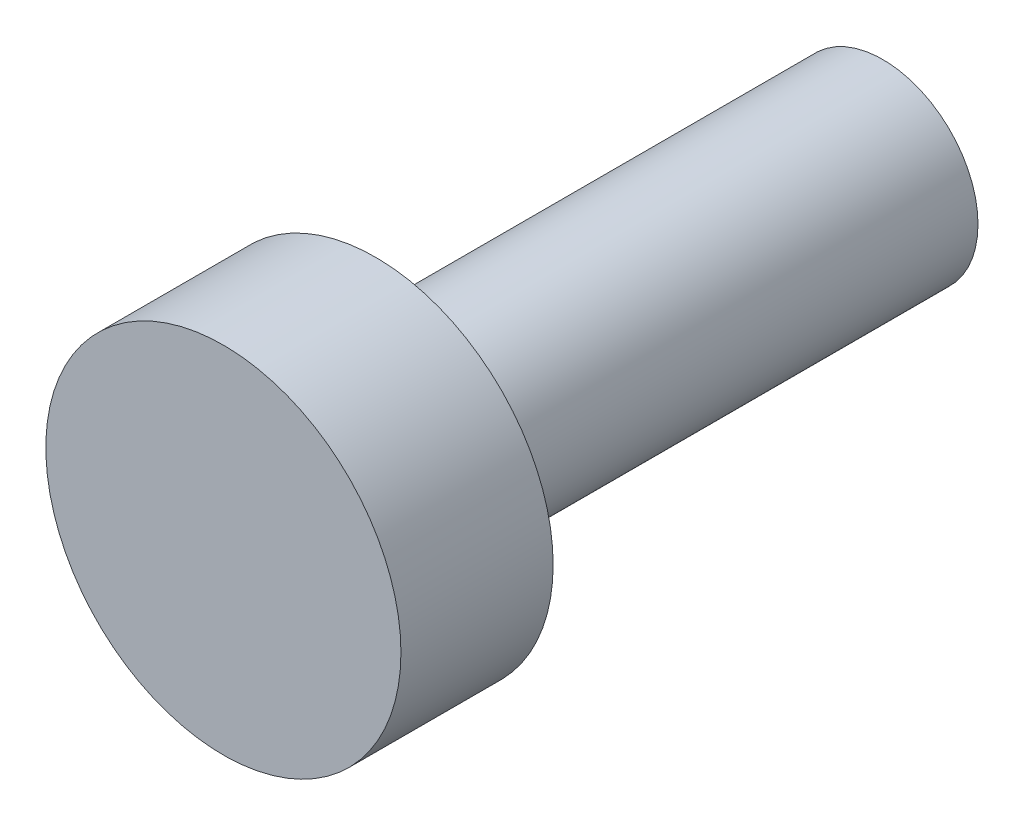
ISO-10303-21;
HEADER;
FILE_DESCRIPTION(('STEP AP214'),'2;1');
FILE_NAME('part.step','',(''),(''),'','','');
FILE_SCHEMA(('AUTOMOTIVE_DESIGN { 1 0 10303 214 1 1 1 1 }'));
ENDSEC;
DATA;
#1=APPLICATION_CONTEXT('core data for automotive mechanical design processes');
#2=APPLICATION_PROTOCOL_DEFINITION('international standard','automotive_design',2000,#1);
#3=PRODUCT_CONTEXT('',#1,'mechanical');
#4=PRODUCT('Part','Part','',(#3));
#5=PRODUCT_RELATED_PRODUCT_CATEGORY('part','',(#4));
#6=PRODUCT_DEFINITION_FORMATION('','',#4);
#7=PRODUCT_DEFINITION_CONTEXT('part definition',#1,'design');
#8=PRODUCT_DEFINITION('design','',#6,#7);
#9=PRODUCT_DEFINITION_SHAPE('','',#8);
#10=(LENGTH_UNIT() NAMED_UNIT(*) SI_UNIT(.MILLI.,.METRE.));
#11=(NAMED_UNIT(*) PLANE_ANGLE_UNIT() SI_UNIT($,.RADIAN.));
#12=(NAMED_UNIT(*) SI_UNIT($,.STERADIAN.) SOLID_ANGLE_UNIT());
#13=UNCERTAINTY_MEASURE_WITH_UNIT(LENGTH_MEASURE(1.E-05),#10,'distance_accuracy_value','');
#14=(GEOMETRIC_REPRESENTATION_CONTEXT(3) GLOBAL_UNCERTAINTY_ASSIGNED_CONTEXT((#13)) GLOBAL_UNIT_ASSIGNED_CONTEXT((#10,
#11,#12)) REPRESENTATION_CONTEXT('',''));
#15=CARTESIAN_POINT('',(0.,0.,0.));
#16=DIRECTION('',(0.,0.,1.));
#17=DIRECTION('',(1.,0.,0.));
#18=AXIS2_PLACEMENT_3D('',#15,#16,#17);
#19=CARTESIAN_POINT('',(0.,0.,2.4));
#20=DIRECTION('',(0.,0.,-1.));
#21=DIRECTION('',(-1.,0.,0.));
#22=AXIS2_PLACEMENT_3D('',#19,#20,#21);
#23=CYLINDRICAL_SURFACE('',#22,2.8);
#24=CARTESIAN_POINT('',(0.,0.,2.4));
#25=DIRECTION('',(0.,0.,1.));
#26=DIRECTION('',(1.,0.,0.));
#27=AXIS2_PLACEMENT_3D('',#24,#25,#26);
#28=CIRCLE('',#27,2.8);
#29=CARTESIAN_POINT('',(2.8,0.,2.4));
#30=VERTEX_POINT('',#29);
#31=EDGE_CURVE('E37',#30,#30,#28,.T.);
#32=ORIENTED_EDGE('',*,*,#31,.F.);
#33=EDGE_LOOP('',(#32));
#34=FACE_BOUND('',#33,.T.);
#35=CARTESIAN_POINT('',(0.,0.,0.));
#36=DIRECTION('',(0.,0.,1.));
#37=DIRECTION('',(1.,0.,0.));
#38=AXIS2_PLACEMENT_3D('',#35,#36,#37);
#39=CIRCLE('',#38,2.8);
#40=CARTESIAN_POINT('',(2.8,0.,0.));
#41=VERTEX_POINT('',#40);
#42=EDGE_CURVE('E33',#41,#41,#39,.T.);
#43=ORIENTED_EDGE('',*,*,#42,.T.);
#44=EDGE_LOOP('',(#43));
#45=FACE_BOUND('',#44,.T.);
#46=ADVANCED_FACE('F30',(#34,#45),#23,.T.);
#47=CARTESIAN_POINT('',(0.,0.,2.4));
#48=DIRECTION('',(0.,0.,1.));
#49=DIRECTION('',(1.,0.,0.));
#50=AXIS2_PLACEMENT_3D('',#47,#48,#49);
#51=PLANE('',#50);
#52=ORIENTED_EDGE('',*,*,#31,.T.);
#53=EDGE_LOOP('',(#52));
#54=FACE_BOUND('',#53,.T.);
#55=ADVANCED_FACE('F54',(#54),#51,.T.);
#56=CARTESIAN_POINT('',(0.,0.,0.));
#57=DIRECTION('',(0.,0.,1.));
#58=DIRECTION('',(1.,0.,0.));
#59=AXIS2_PLACEMENT_3D('',#56,#57,#58);
#60=PLANE('',#59);
#61=CARTESIAN_POINT('',(0.,0.,0.));
#62=DIRECTION('',(0.,0.,-1.));
#63=DIRECTION('',(-1.,0.,0.));
#64=AXIS2_PLACEMENT_3D('',#61,#62,#63);
#65=CIRCLE('',#64,1.5);
#66=CARTESIAN_POINT('',(-1.5,0.,0.));
#67=VERTEX_POINT('',#66);
#68=EDGE_CURVE('E10',#67,#67,#65,.T.);
#69=ORIENTED_EDGE('',*,*,#68,.F.);
#70=EDGE_LOOP('',(#69));
#71=FACE_BOUND('',#70,.T.);
#72=ORIENTED_EDGE('',*,*,#42,.F.);
#73=EDGE_LOOP('',(#72));
#74=FACE_BOUND('',#73,.T.);
#75=ADVANCED_FACE('F51',(#71,#74),#60,.F.);
#76=CARTESIAN_POINT('',(0.,0.,-8.));
#77=DIRECTION('',(0.,0.,1.));
#78=DIRECTION('',(1.,0.,0.));
#79=AXIS2_PLACEMENT_3D('',#76,#77,#78);
#80=CYLINDRICAL_SURFACE('',#79,1.5);
#81=CARTESIAN_POINT('',(0.,0.,-8.));
#82=DIRECTION('',(0.,0.,-1.));
#83=DIRECTION('',(-1.,0.,0.));
#84=AXIS2_PLACEMENT_3D('',#81,#82,#83);
#85=CIRCLE('',#84,1.5);
#86=CARTESIAN_POINT('',(-1.5,0.,-8.));
#87=VERTEX_POINT('',#86);
#88=EDGE_CURVE('E43',#87,#87,#85,.T.);
#89=ORIENTED_EDGE('',*,*,#88,.F.);
#90=EDGE_LOOP('',(#89));
#91=FACE_BOUND('',#90,.T.);
#92=ORIENTED_EDGE('',*,*,#68,.T.);
#93=EDGE_LOOP('',(#92));
#94=FACE_BOUND('',#93,.T.);
#95=ADVANCED_FACE('F53',(#91,#94),#80,.T.);
#96=CARTESIAN_POINT('',(0.,0.,-8.));
#97=DIRECTION('',(0.,0.,-1.));
#98=DIRECTION('',(-1.,0.,0.));
#99=AXIS2_PLACEMENT_3D('',#96,#97,#98);
#100=PLANE('',#99);
#101=ORIENTED_EDGE('',*,*,#88,.T.);
#102=EDGE_LOOP('',(#101));
#103=FACE_BOUND('',#102,.T.);
#104=ADVANCED_FACE('F60',(#103),#100,.T.);
#105=CLOSED_SHELL('',(#46,#55,#75,#95,#104));
#106=MANIFOLD_SOLID_BREP('B2',#105);
#107=ADVANCED_BREP_SHAPE_REPRESENTATION('',(#18,#106),#14);
#108=SHAPE_DEFINITION_REPRESENTATION(#9,#107);
ENDSEC;
END-ISO-10303-21;
